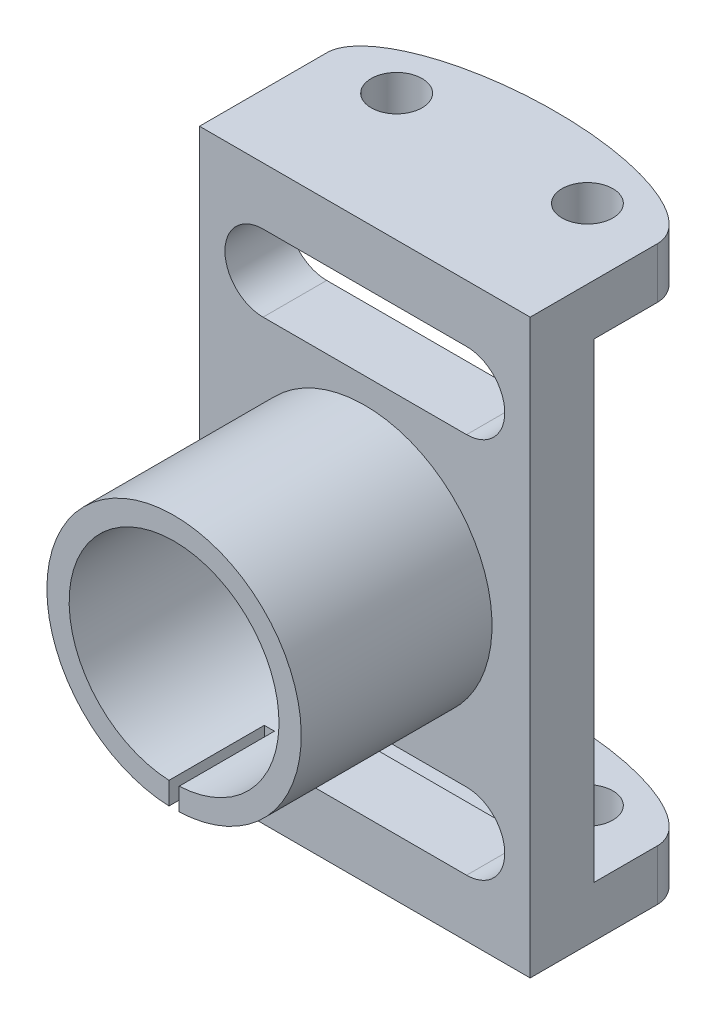
ISO-10303-21;
HEADER;
FILE_DESCRIPTION(('STEP AP214'),'2;1');
FILE_NAME('part.step','',(''),(''),'','','');
FILE_SCHEMA(('AUTOMOTIVE_DESIGN { 1 0 10303 214 1 1 1 1 }'));
ENDSEC;
DATA;
#1=APPLICATION_CONTEXT('core data for automotive mechanical design processes');
#2=APPLICATION_PROTOCOL_DEFINITION('international standard','automotive_design',2000,#1);
#3=PRODUCT_CONTEXT('',#1,'mechanical');
#4=PRODUCT('Part','Part','',(#3));
#5=PRODUCT_RELATED_PRODUCT_CATEGORY('part','',(#4));
#6=PRODUCT_DEFINITION_FORMATION('','',#4);
#7=PRODUCT_DEFINITION_CONTEXT('part definition',#1,'design');
#8=PRODUCT_DEFINITION('design','',#6,#7);
#9=PRODUCT_DEFINITION_SHAPE('','',#8);
#10=(LENGTH_UNIT() NAMED_UNIT(*) SI_UNIT(.MILLI.,.METRE.));
#11=(NAMED_UNIT(*) PLANE_ANGLE_UNIT() SI_UNIT($,.RADIAN.));
#12=(NAMED_UNIT(*) SI_UNIT($,.STERADIAN.) SOLID_ANGLE_UNIT());
#13=UNCERTAINTY_MEASURE_WITH_UNIT(LENGTH_MEASURE(1.E-05),#10,'distance_accuracy_value','');
#14=(GEOMETRIC_REPRESENTATION_CONTEXT(3) GLOBAL_UNCERTAINTY_ASSIGNED_CONTEXT((#13)) GLOBAL_UNIT_ASSIGNED_CONTEXT((#10,
#11,#12)) REPRESENTATION_CONTEXT('',''));
#15=CARTESIAN_POINT('',(0.,0.,0.));
#16=DIRECTION('',(0.,0.,1.));
#17=DIRECTION('',(1.,0.,0.));
#18=AXIS2_PLACEMENT_3D('',#15,#16,#17);
#19=CARTESIAN_POINT('',(0.,0.,0.));
#20=DIRECTION('',(0.,0.,-1.));
#21=DIRECTION('',(-1.,0.,0.));
#22=AXIS2_PLACEMENT_3D('',#19,#20,#21);
#23=PLANE('',#22);
#24=DIRECTION('',(1.,0.,0.));
#25=VECTOR('',#24,1.);
#26=CARTESIAN_POINT('',(0.,4.,0.));
#27=LINE('',#26,#25);
#28=CARTESIAN_POINT('',(0.,4.,0.));
#29=VERTEX_POINT('',#28);
#30=CARTESIAN_POINT('',(26.,4.,0.));
#31=VERTEX_POINT('',#30);
#32=EDGE_CURVE('E193',#29,#31,#27,.T.);
#33=ORIENTED_EDGE('',*,*,#32,.F.);
#34=DIRECTION('',(0.,-1.,0.));
#35=VECTOR('',#34,1.);
#36=CARTESIAN_POINT('',(0.,0.,0.));
#37=LINE('',#36,#35);
#38=CARTESIAN_POINT('',(0.,41.,0.));
#39=VERTEX_POINT('',#38);
#40=EDGE_CURVE('E190',#39,#29,#37,.T.);
#41=ORIENTED_EDGE('',*,*,#40,.F.);
#42=DIRECTION('',(1.,0.,0.));
#43=VECTOR('',#42,1.);
#44=CARTESIAN_POINT('',(0.,41.,0.));
#45=LINE('',#44,#43);
#46=CARTESIAN_POINT('',(26.,41.,0.));
#47=VERTEX_POINT('',#46);
#48=EDGE_CURVE('E363',#39,#47,#45,.T.);
#49=ORIENTED_EDGE('',*,*,#48,.T.);
#50=DIRECTION('',(0.,1.,0.));
#51=VECTOR('',#50,1.);
#52=CARTESIAN_POINT('',(26.,0.,0.));
#53=LINE('',#52,#51);
#54=EDGE_CURVE('E65',#31,#47,#53,.T.);
#55=ORIENTED_EDGE('',*,*,#54,.F.);
#56=EDGE_LOOP('',(#33,#41,#49,#55));
#57=FACE_BOUND('',#56,.T.);
#58=CARTESIAN_POINT('',(13.,22.5,0.));
#59=DIRECTION('',(0.,0.,1.));
#60=DIRECTION('',(1.,0.,0.));
#61=AXIS2_PLACEMENT_3D('',#58,#59,#60);
#62=CIRCLE('',#61,8.25);
#63=CARTESIAN_POINT('',(21.25,22.5,0.));
#64=VERTEX_POINT('',#63);
#65=EDGE_CURVE('E463',#64,#64,#62,.T.);
#66=ORIENTED_EDGE('',*,*,#65,.T.);
#67=EDGE_LOOP('',(#66));
#68=FACE_BOUND('',#67,.T.);
#69=DIRECTION('',(1.,0.,0.));
#70=VECTOR('',#69,1.);
#71=CARTESIAN_POINT('',(21.,34.5,0.));
#72=LINE('',#71,#70);
#73=CARTESIAN_POINT('',(5.,34.5,0.));
#74=VERTEX_POINT('',#73);
#75=CARTESIAN_POINT('',(21.,34.5,0.));
#76=VERTEX_POINT('',#75);
#77=EDGE_CURVE('E436',#74,#76,#72,.T.);
#78=ORIENTED_EDGE('',*,*,#77,.T.);
#79=CARTESIAN_POINT('',(21.,37.5,0.));
#80=DIRECTION('',(0.,0.,1.));
#81=DIRECTION('',(1.,0.,0.));
#82=AXIS2_PLACEMENT_3D('',#79,#80,#81);
#83=CIRCLE('',#82,3.00000000000002);
#84=CARTESIAN_POINT('',(21.,40.5,0.));
#85=VERTEX_POINT('',#84);
#86=EDGE_CURVE('E432',#76,#85,#83,.T.);
#87=ORIENTED_EDGE('',*,*,#86,.T.);
#88=DIRECTION('',(-1.,0.,0.));
#89=VECTOR('',#88,1.);
#90=CARTESIAN_POINT('',(21.,40.5,0.));
#91=LINE('',#90,#89);
#92=CARTESIAN_POINT('',(4.99999999999999,40.5,0.));
#93=VERTEX_POINT('',#92);
#94=EDGE_CURVE('E446',#85,#93,#91,.T.);
#95=ORIENTED_EDGE('',*,*,#94,.T.);
#96=CARTESIAN_POINT('',(5.,37.5,0.));
#97=DIRECTION('',(0.,0.,1.));
#98=DIRECTION('',(1.,0.,0.));
#99=AXIS2_PLACEMENT_3D('',#96,#97,#98);
#100=CIRCLE('',#99,3.00000000000002);
#101=EDGE_CURVE('E449',#93,#74,#100,.T.);
#102=ORIENTED_EDGE('',*,*,#101,.T.);
#103=EDGE_LOOP('',(#78,#87,#95,#102));
#104=FACE_BOUND('',#103,.T.);
#105=DIRECTION('',(1.,0.,0.));
#106=VECTOR('',#105,1.);
#107=CARTESIAN_POINT('',(21.,4.49999999999997,0.));
#108=LINE('',#107,#106);
#109=CARTESIAN_POINT('',(5.,4.49999999999998,0.));
#110=VERTEX_POINT('',#109);
#111=CARTESIAN_POINT('',(21.,4.49999999999997,0.));
#112=VERTEX_POINT('',#111);
#113=EDGE_CURVE('E405',#110,#112,#108,.T.);
#114=ORIENTED_EDGE('',*,*,#113,.T.);
#115=CARTESIAN_POINT('',(21.,7.5,0.));
#116=DIRECTION('',(0.,0.,1.));
#117=DIRECTION('',(-1.,0.,0.));
#118=AXIS2_PLACEMENT_3D('',#115,#116,#117);
#119=CIRCLE('',#118,3.00000000000002);
#120=CARTESIAN_POINT('',(21.,10.5,0.));
#121=VERTEX_POINT('',#120);
#122=EDGE_CURVE('E401',#112,#121,#119,.T.);
#123=ORIENTED_EDGE('',*,*,#122,.T.);
#124=DIRECTION('',(-1.,0.,0.));
#125=VECTOR('',#124,1.);
#126=CARTESIAN_POINT('',(21.,10.5,0.));
#127=LINE('',#126,#125);
#128=CARTESIAN_POINT('',(5.,10.5,0.));
#129=VERTEX_POINT('',#128);
#130=EDGE_CURVE('E415',#121,#129,#127,.T.);
#131=ORIENTED_EDGE('',*,*,#130,.T.);
#132=CARTESIAN_POINT('',(5.,7.5,0.));
#133=DIRECTION('',(0.,0.,1.));
#134=DIRECTION('',(-1.,0.,0.));
#135=AXIS2_PLACEMENT_3D('',#132,#133,#134);
#136=CIRCLE('',#135,3.00000000000002);
#137=EDGE_CURVE('E418',#129,#110,#136,.T.);
#138=ORIENTED_EDGE('',*,*,#137,.T.);
#139=EDGE_LOOP('',(#114,#123,#131,#138));
#140=FACE_BOUND('',#139,.T.);
#141=ADVANCED_FACE('F45',(#57,#68,#104,#140),#23,.T.);
#142=CARTESIAN_POINT('',(13.,22.5,12.5));
#143=DIRECTION('',(0.,0.,1.));
#144=DIRECTION('',(1.,0.,0.));
#145=AXIS2_PLACEMENT_3D('',#142,#143,#144);
#146=PLANE('',#145);
#147=CARTESIAN_POINT('',(13.,22.5,12.5));
#148=DIRECTION('',(0.,0.,1.));
#149=DIRECTION('',(1.,0.,0.));
#150=AXIS2_PLACEMENT_3D('',#147,#148,#149);
#151=CIRCLE('',#150,8.25);
#152=CARTESIAN_POINT('',(12.6,14.2597026752671,12.5));
#153=VERTEX_POINT('',#152);
#154=CARTESIAN_POINT('',(13.4,14.2597026752671,12.5));
#155=VERTEX_POINT('',#154);
#156=EDGE_CURVE('E396',#153,#155,#151,.T.);
#157=ORIENTED_EDGE('',*,*,#156,.F.);
#158=DIRECTION('',(0.,-1.,0.));
#159=VECTOR('',#158,1.);
#160=CARTESIAN_POINT('',(12.6,0.,12.5));
#161=LINE('',#160,#159);
#162=CARTESIAN_POINT('',(12.6,12.5080032025626,12.5));
#163=VERTEX_POINT('',#162);
#164=EDGE_CURVE('E369',#153,#163,#161,.T.);
#165=ORIENTED_EDGE('',*,*,#164,.T.);
#166=CARTESIAN_POINT('',(13.,22.5,12.5));
#167=DIRECTION('',(0.,0.,1.));
#168=DIRECTION('',(1.,0.,0.));
#169=AXIS2_PLACEMENT_3D('',#166,#167,#168);
#170=CIRCLE('',#169,10.);
#171=CARTESIAN_POINT('',(13.4,12.5080032025626,12.5));
#172=VERTEX_POINT('',#171);
#173=EDGE_CURVE('E399',#163,#172,#170,.T.);
#174=ORIENTED_EDGE('',*,*,#173,.T.);
#175=DIRECTION('',(0.,-1.,0.));
#176=VECTOR('',#175,1.);
#177=CARTESIAN_POINT('',(13.4,0.,12.5));
#178=LINE('',#177,#176);
#179=EDGE_CURVE('E375',#155,#172,#178,.T.);
#180=ORIENTED_EDGE('',*,*,#179,.F.);
#181=EDGE_LOOP('',(#157,#165,#174,#180));
#182=FACE_BOUND('',#181,.T.);
#183=ADVANCED_FACE('F250',(#182),#146,.T.);
#184=CARTESIAN_POINT('',(0.,0.,5.));
#185=DIRECTION('',(0.,0.,-1.));
#186=DIRECTION('',(-1.,0.,0.));
#187=AXIS2_PLACEMENT_3D('',#184,#185,#186);
#188=PLANE('',#187);
#189=CARTESIAN_POINT('',(21.,7.5,5.));
#190=DIRECTION('',(0.,0.,1.));
#191=DIRECTION('',(-1.,0.,0.));
#192=AXIS2_PLACEMENT_3D('',#189,#190,#191);
#193=CIRCLE('',#192,3.00000000000002);
#194=CARTESIAN_POINT('',(21.,4.49999999999997,5.));
#195=VERTEX_POINT('',#194);
#196=CARTESIAN_POINT('',(21.,10.5,5.));
#197=VERTEX_POINT('',#196);
#198=EDGE_CURVE('E402',#195,#197,#193,.T.);
#199=ORIENTED_EDGE('',*,*,#198,.F.);
#200=DIRECTION('',(1.,0.,0.));
#201=VECTOR('',#200,1.);
#202=CARTESIAN_POINT('',(21.,4.49999999999997,5.));
#203=LINE('',#202,#201);
#204=CARTESIAN_POINT('',(5.,4.49999999999997,5.));
#205=VERTEX_POINT('',#204);
#206=EDGE_CURVE('E410',#205,#195,#203,.T.);
#207=ORIENTED_EDGE('',*,*,#206,.F.);
#208=CARTESIAN_POINT('',(5.,7.5,5.));
#209=DIRECTION('',(0.,0.,1.));
#210=DIRECTION('',(-1.,0.,0.));
#211=AXIS2_PLACEMENT_3D('',#208,#209,#210);
#212=CIRCLE('',#211,3.00000000000002);
#213=CARTESIAN_POINT('',(5.,10.5,5.));
#214=VERTEX_POINT('',#213);
#215=EDGE_CURVE('E407',#214,#205,#212,.T.);
#216=ORIENTED_EDGE('',*,*,#215,.F.);
#217=DIRECTION('',(-1.,0.,0.));
#218=VECTOR('',#217,1.);
#219=CARTESIAN_POINT('',(21.,10.5,5.));
#220=LINE('',#219,#218);
#221=EDGE_CURVE('E404',#197,#214,#220,.T.);
#222=ORIENTED_EDGE('',*,*,#221,.F.);
#223=EDGE_LOOP('',(#199,#207,#216,#222));
#224=FACE_BOUND('',#223,.T.);
#225=DIRECTION('',(0.,-1.,0.));
#226=VECTOR('',#225,1.);
#227=CARTESIAN_POINT('',(0.,0.,5.));
#228=LINE('',#227,#226);
#229=CARTESIAN_POINT('',(0.,45.,5.));
#230=VERTEX_POINT('',#229);
#231=CARTESIAN_POINT('',(0.,0.,5.));
#232=VERTEX_POINT('',#231);
#233=EDGE_CURVE('E466',#230,#232,#228,.T.);
#234=ORIENTED_EDGE('',*,*,#233,.T.);
#235=DIRECTION('',(1.,0.,0.));
#236=VECTOR('',#235,1.);
#237=CARTESIAN_POINT('',(0.,0.,5.));
#238=LINE('',#237,#236);
#239=CARTESIAN_POINT('',(26.,0.,5.));
#240=VERTEX_POINT('',#239);
#241=EDGE_CURVE('E469',#232,#240,#238,.T.);
#242=ORIENTED_EDGE('',*,*,#241,.T.);
#243=DIRECTION('',(0.,1.,0.));
#244=VECTOR('',#243,1.);
#245=CARTESIAN_POINT('',(26.,0.,5.));
#246=LINE('',#245,#244);
#247=CARTESIAN_POINT('',(26.,45.,5.));
#248=VERTEX_POINT('',#247);
#249=EDGE_CURVE('E471',#240,#248,#246,.T.);
#250=ORIENTED_EDGE('',*,*,#249,.T.);
#251=DIRECTION('',(-1.,0.,0.));
#252=VECTOR('',#251,1.);
#253=CARTESIAN_POINT('',(0.,45.,5.));
#254=LINE('',#253,#252);
#255=EDGE_CURVE('E473',#248,#230,#254,.T.);
#256=ORIENTED_EDGE('',*,*,#255,.T.);
#257=EDGE_LOOP('',(#234,#242,#250,#256));
#258=FACE_BOUND('',#257,.T.);
#259=CARTESIAN_POINT('',(21.,37.5,5.));
#260=DIRECTION('',(0.,0.,1.));
#261=DIRECTION('',(1.,0.,0.));
#262=AXIS2_PLACEMENT_3D('',#259,#260,#261);
#263=CIRCLE('',#262,3.00000000000002);
#264=CARTESIAN_POINT('',(21.,34.5,5.));
#265=VERTEX_POINT('',#264);
#266=CARTESIAN_POINT('',(21.,40.5,5.));
#267=VERTEX_POINT('',#266);
#268=EDGE_CURVE('E433',#265,#267,#263,.T.);
#269=ORIENTED_EDGE('',*,*,#268,.F.);
#270=DIRECTION('',(1.,0.,0.));
#271=VECTOR('',#270,1.);
#272=CARTESIAN_POINT('',(21.,34.5,5.));
#273=LINE('',#272,#271);
#274=CARTESIAN_POINT('',(5.,34.5,5.));
#275=VERTEX_POINT('',#274);
#276=EDGE_CURVE('E441',#275,#265,#273,.T.);
#277=ORIENTED_EDGE('',*,*,#276,.F.);
#278=CARTESIAN_POINT('',(5.,37.5,5.));
#279=DIRECTION('',(0.,0.,1.));
#280=DIRECTION('',(1.,0.,0.));
#281=AXIS2_PLACEMENT_3D('',#278,#279,#280);
#282=CIRCLE('',#281,3.00000000000002);
#283=CARTESIAN_POINT('',(4.99999999999999,40.5,5.));
#284=VERTEX_POINT('',#283);
#285=EDGE_CURVE('E438',#284,#275,#282,.T.);
#286=ORIENTED_EDGE('',*,*,#285,.F.);
#287=DIRECTION('',(-1.,0.,0.));
#288=VECTOR('',#287,1.);
#289=CARTESIAN_POINT('',(21.,40.5,5.));
#290=LINE('',#289,#288);
#291=EDGE_CURVE('E435',#267,#284,#290,.T.);
#292=ORIENTED_EDGE('',*,*,#291,.F.);
#293=EDGE_LOOP('',(#269,#277,#286,#292));
#294=FACE_BOUND('',#293,.T.);
#295=CARTESIAN_POINT('',(13.,22.5,5.));
#296=DIRECTION('',(0.,0.,-1.));
#297=DIRECTION('',(-1.,0.,0.));
#298=AXIS2_PLACEMENT_3D('',#295,#296,#297);
#299=CIRCLE('',#298,10.);
#300=CARTESIAN_POINT('',(3.,22.5,5.));
#301=VERTEX_POINT('',#300);
#302=EDGE_CURVE('E11',#301,#301,#299,.F.);
#303=ORIENTED_EDGE('',*,*,#302,.F.);
#304=EDGE_LOOP('',(#303));
#305=FACE_BOUND('',#304,.T.);
#306=ADVANCED_FACE('F253',(#224,#258,#294,#305),#188,.F.);
#307=CARTESIAN_POINT('',(0.,0.,5.));
#308=DIRECTION('',(1.,0.,0.));
#309=DIRECTION('',(0.,0.,-1.));
#310=AXIS2_PLACEMENT_3D('',#307,#308,#309);
#311=PLANE('',#310);
#312=DIRECTION('',(0.,0.,-1.));
#313=VECTOR('',#312,1.);
#314=CARTESIAN_POINT('',(0.,45.,5.));
#315=LINE('',#314,#313);
#316=CARTESIAN_POINT('',(0.,45.,-5.));
#317=VERTEX_POINT('',#316);
#318=EDGE_CURVE('E475',#230,#317,#315,.T.);
#319=ORIENTED_EDGE('',*,*,#318,.T.);
#320=DIRECTION('',(0.,1.,0.));
#321=VECTOR('',#320,1.);
#322=CARTESIAN_POINT('',(0.,41.,-5.));
#323=LINE('',#322,#321);
#324=CARTESIAN_POINT('',(0.,41.,-5.));
#325=VERTEX_POINT('',#324);
#326=EDGE_CURVE('E362',#325,#317,#323,.T.);
#327=ORIENTED_EDGE('',*,*,#326,.F.);
#328=DIRECTION('',(0.,0.,1.));
#329=VECTOR('',#328,1.);
#330=CARTESIAN_POINT('',(0.,41.,-5.));
#331=LINE('',#330,#329);
#332=EDGE_CURVE('E227',#325,#39,#331,.T.);
#333=ORIENTED_EDGE('',*,*,#332,.T.);
#334=ORIENTED_EDGE('',*,*,#40,.T.);
#335=DIRECTION('',(0.,0.,1.));
#336=VECTOR('',#335,1.);
#337=CARTESIAN_POINT('',(0.,4.,-5.));
#338=LINE('',#337,#336);
#339=CARTESIAN_POINT('',(0.,4.,-5.));
#340=VERTEX_POINT('',#339);
#341=EDGE_CURVE('E182',#340,#29,#338,.T.);
#342=ORIENTED_EDGE('',*,*,#341,.F.);
#343=DIRECTION('',(0.,-1.,0.));
#344=VECTOR('',#343,1.);
#345=CARTESIAN_POINT('',(0.,4.,-5.));
#346=LINE('',#345,#344);
#347=CARTESIAN_POINT('',(0.,0.,-5.));
#348=VERTEX_POINT('',#347);
#349=EDGE_CURVE('E186',#340,#348,#346,.T.);
#350=ORIENTED_EDGE('',*,*,#349,.T.);
#351=DIRECTION('',(0.,0.,-1.));
#352=VECTOR('',#351,1.);
#353=CARTESIAN_POINT('',(0.,0.,5.));
#354=LINE('',#353,#352);
#355=EDGE_CURVE('E53',#232,#348,#354,.T.);
#356=ORIENTED_EDGE('',*,*,#355,.F.);
#357=ORIENTED_EDGE('',*,*,#233,.F.);
#358=EDGE_LOOP('',(#319,#327,#333,#334,#342,#350,#356,#357));
#359=FACE_BOUND('',#358,.T.);
#360=ADVANCED_FACE('F47',(#359),#311,.F.);
#361=CARTESIAN_POINT('',(0.,0.,5.));
#362=DIRECTION('',(0.,1.,0.));
#363=DIRECTION('',(0.,0.,1.));
#364=AXIS2_PLACEMENT_3D('',#361,#362,#363);
#365=PLANE('',#364);
#366=ORIENTED_EDGE('',*,*,#355,.T.);
#367=CARTESIAN_POINT('',(13.,0.,-5.));
#368=DIRECTION('',(0.,1.,0.));
#369=DIRECTION('',(1.,0.,0.));
#370=AXIS2_PLACEMENT_3D('',#367,#368,#369);
#371=ELLIPSE('',#370,13.,5.);
#372=CARTESIAN_POINT('',(26.,0.,-5.));
#373=VERTEX_POINT('',#372);
#374=EDGE_CURVE('E201',#373,#348,#371,.T.);
#375=ORIENTED_EDGE('',*,*,#374,.F.);
#376=DIRECTION('',(0.,0.,-1.));
#377=VECTOR('',#376,1.);
#378=CARTESIAN_POINT('',(26.,0.,5.));
#379=LINE('',#378,#377);
#380=EDGE_CURVE('E481',#240,#373,#379,.T.);
#381=ORIENTED_EDGE('',*,*,#380,.F.);
#382=ORIENTED_EDGE('',*,*,#241,.F.);
#383=EDGE_LOOP('',(#366,#375,#381,#382));
#384=FACE_BOUND('',#383,.T.);
#385=CARTESIAN_POINT('',(5.5,0.,-5.));
#386=DIRECTION('',(0.,1.,0.));
#387=DIRECTION('',(0.,0.,1.));
#388=AXIS2_PLACEMENT_3D('',#385,#386,#387);
#389=CIRCLE('',#388,2.);
#390=CARTESIAN_POINT('',(5.5,0.,-3.));
#391=VERTEX_POINT('',#390);
#392=EDGE_CURVE('E316',#391,#391,#389,.T.);
#393=ORIENTED_EDGE('',*,*,#392,.T.);
#394=EDGE_LOOP('',(#393));
#395=FACE_BOUND('',#394,.T.);
#396=CARTESIAN_POINT('',(20.5,0.,-5.));
#397=DIRECTION('',(0.,1.,0.));
#398=DIRECTION('',(0.,0.,1.));
#399=AXIS2_PLACEMENT_3D('',#396,#397,#398);
#400=CIRCLE('',#399,2.);
#401=CARTESIAN_POINT('',(20.5,0.,-3.));
#402=VERTEX_POINT('',#401);
#403=EDGE_CURVE('E319',#402,#402,#400,.T.);
#404=ORIENTED_EDGE('',*,*,#403,.T.);
#405=EDGE_LOOP('',(#404));
#406=FACE_BOUND('',#405,.T.);
#407=ADVANCED_FACE('F306',(#384,#395,#406),#365,.F.);
#408=CARTESIAN_POINT('',(26.,0.,5.));
#409=DIRECTION('',(-1.,0.,0.));
#410=DIRECTION('',(0.,0.,1.));
#411=AXIS2_PLACEMENT_3D('',#408,#409,#410);
#412=PLANE('',#411);
#413=ORIENTED_EDGE('',*,*,#380,.T.);
#414=DIRECTION('',(0.,-1.,0.));
#415=VECTOR('',#414,1.);
#416=CARTESIAN_POINT('',(26.,4.,-5.));
#417=LINE('',#416,#415);
#418=CARTESIAN_POINT('',(26.,4.,-5.));
#419=VERTEX_POINT('',#418);
#420=EDGE_CURVE('E206',#419,#373,#417,.T.);
#421=ORIENTED_EDGE('',*,*,#420,.F.);
#422=DIRECTION('',(0.,0.,-1.));
#423=VECTOR('',#422,1.);
#424=CARTESIAN_POINT('',(26.,4.,0.));
#425=LINE('',#424,#423);
#426=EDGE_CURVE('E60',#31,#419,#425,.T.);
#427=ORIENTED_EDGE('',*,*,#426,.F.);
#428=ORIENTED_EDGE('',*,*,#54,.T.);
#429=DIRECTION('',(0.,0.,-1.));
#430=VECTOR('',#429,1.);
#431=CARTESIAN_POINT('',(26.,41.,0.));
#432=LINE('',#431,#430);
#433=CARTESIAN_POINT('',(26.,41.,-5.));
#434=VERTEX_POINT('',#433);
#435=EDGE_CURVE('E355',#47,#434,#432,.T.);
#436=ORIENTED_EDGE('',*,*,#435,.T.);
#437=DIRECTION('',(0.,1.,0.));
#438=VECTOR('',#437,1.);
#439=CARTESIAN_POINT('',(26.,41.,-5.));
#440=LINE('',#439,#438);
#441=CARTESIAN_POINT('',(26.,45.,-5.));
#442=VERTEX_POINT('',#441);
#443=EDGE_CURVE('E360',#434,#442,#440,.T.);
#444=ORIENTED_EDGE('',*,*,#443,.T.);
#445=DIRECTION('',(0.,0.,-1.));
#446=VECTOR('',#445,1.);
#447=CARTESIAN_POINT('',(26.,45.,5.));
#448=LINE('',#447,#446);
#449=EDGE_CURVE('E479',#248,#442,#448,.T.);
#450=ORIENTED_EDGE('',*,*,#449,.F.);
#451=ORIENTED_EDGE('',*,*,#249,.F.);
#452=EDGE_LOOP('',(#413,#421,#427,#428,#436,#444,#450,#451));
#453=FACE_BOUND('',#452,.T.);
#454=ADVANCED_FACE('F303',(#453),#412,.F.);
#455=CARTESIAN_POINT('',(0.,45.,5.));
#456=DIRECTION('',(0.,-1.,0.));
#457=DIRECTION('',(0.,0.,-1.));
#458=AXIS2_PLACEMENT_3D('',#455,#456,#457);
#459=PLANE('',#458);
#460=ORIENTED_EDGE('',*,*,#449,.T.);
#461=CARTESIAN_POINT('',(13.,45.,-5.));
#462=DIRECTION('',(0.,1.,0.));
#463=DIRECTION('',(1.,0.,0.));
#464=AXIS2_PLACEMENT_3D('',#461,#462,#463);
#465=ELLIPSE('',#464,13.,5.);
#466=EDGE_CURVE('E220',#442,#317,#465,.T.);
#467=ORIENTED_EDGE('',*,*,#466,.T.);
#468=ORIENTED_EDGE('',*,*,#318,.F.);
#469=ORIENTED_EDGE('',*,*,#255,.F.);
#470=EDGE_LOOP('',(#460,#467,#468,#469));
#471=FACE_BOUND('',#470,.T.);
#472=CARTESIAN_POINT('',(20.5,45.,-5.));
#473=DIRECTION('',(0.,1.,0.));
#474=DIRECTION('',(0.,0.,1.));
#475=AXIS2_PLACEMENT_3D('',#472,#473,#474);
#476=CIRCLE('',#475,2.);
#477=CARTESIAN_POINT('',(20.5,45.,-3.));
#478=VERTEX_POINT('',#477);
#479=EDGE_CURVE('E205',#478,#478,#476,.T.);
#480=ORIENTED_EDGE('',*,*,#479,.F.);
#481=EDGE_LOOP('',(#480));
#482=FACE_BOUND('',#481,.T.);
#483=CARTESIAN_POINT('',(5.5,45.,-5.));
#484=DIRECTION('',(0.,1.,0.));
#485=DIRECTION('',(0.,0.,1.));
#486=AXIS2_PLACEMENT_3D('',#483,#484,#485);
#487=CIRCLE('',#486,2.);
#488=CARTESIAN_POINT('',(5.5,45.,-3.));
#489=VERTEX_POINT('',#488);
#490=EDGE_CURVE('E215',#489,#489,#487,.T.);
#491=ORIENTED_EDGE('',*,*,#490,.F.);
#492=EDGE_LOOP('',(#491));
#493=FACE_BOUND('',#492,.T.);
#494=ADVANCED_FACE('F293',(#471,#482,#493),#459,.F.);
#495=CARTESIAN_POINT('',(13.,22.5,5.));
#496=DIRECTION('',(0.,0.,-1.));
#497=DIRECTION('',(-1.,0.,0.));
#498=AXIS2_PLACEMENT_3D('',#495,#496,#497);
#499=CYLINDRICAL_SURFACE('',#498,8.25);
#500=ORIENTED_EDGE('',*,*,#65,.F.);
#501=EDGE_LOOP('',(#500));
#502=FACE_BOUND('',#501,.T.);
#503=ORIENTED_EDGE('',*,*,#156,.T.);
#504=DIRECTION('',(0.,0.,-1.));
#505=VECTOR('',#504,1.);
#506=CARTESIAN_POINT('',(13.4,14.2597026752671,20.));
#507=LINE('',#506,#505);
#508=CARTESIAN_POINT('',(13.4,14.2597026752671,20.));
#509=VERTEX_POINT('',#508);
#510=EDGE_CURVE('E390',#509,#155,#507,.T.);
#511=ORIENTED_EDGE('',*,*,#510,.F.);
#512=CARTESIAN_POINT('',(13.,22.5,20.));
#513=DIRECTION('',(0.,0.,1.));
#514=DIRECTION('',(1.,0.,0.));
#515=AXIS2_PLACEMENT_3D('',#512,#513,#514);
#516=CIRCLE('',#515,8.25);
#517=CARTESIAN_POINT('',(12.6,14.2597026752671,20.));
#518=VERTEX_POINT('',#517);
#519=EDGE_CURVE('E374',#518,#509,#516,.F.);
#520=ORIENTED_EDGE('',*,*,#519,.F.);
#521=DIRECTION('',(0.,0.,-1.));
#522=VECTOR('',#521,1.);
#523=CARTESIAN_POINT('',(12.6,14.2597026752671,20.));
#524=LINE('',#523,#522);
#525=EDGE_CURVE('E393',#518,#153,#524,.T.);
#526=ORIENTED_EDGE('',*,*,#525,.T.);
#527=EDGE_LOOP('',(#503,#511,#520,#526));
#528=FACE_BOUND('',#527,.T.);
#529=ADVANCED_FACE('F289',(#502,#528),#499,.F.);
#530=CARTESIAN_POINT('',(21.,37.5,5.));
#531=DIRECTION('',(0.,0.,-1.));
#532=DIRECTION('',(-1.,0.,0.));
#533=AXIS2_PLACEMENT_3D('',#530,#531,#532);
#534=CYLINDRICAL_SURFACE('',#533,3.00000000000002);
#535=ORIENTED_EDGE('',*,*,#86,.F.);
#536=DIRECTION('',(0.,0.,-1.));
#537=VECTOR('',#536,1.);
#538=CARTESIAN_POINT('',(21.,34.5,5.));
#539=LINE('',#538,#537);
#540=EDGE_CURVE('E443',#265,#76,#539,.T.);
#541=ORIENTED_EDGE('',*,*,#540,.F.);
#542=ORIENTED_EDGE('',*,*,#268,.T.);
#543=DIRECTION('',(0.,0.,-1.));
#544=VECTOR('',#543,1.);
#545=CARTESIAN_POINT('',(21.,40.5,5.));
#546=LINE('',#545,#544);
#547=EDGE_CURVE('E460',#267,#85,#546,.T.);
#548=ORIENTED_EDGE('',*,*,#547,.T.);
#549=EDGE_LOOP('',(#535,#541,#542,#548));
#550=FACE_BOUND('',#549,.T.);
#551=ADVANCED_FACE('F285',(#550),#534,.F.);
#552=CARTESIAN_POINT('',(21.,40.5,5.));
#553=DIRECTION('',(0.,-1.,0.));
#554=DIRECTION('',(0.,0.,-1.));
#555=AXIS2_PLACEMENT_3D('',#552,#553,#554);
#556=PLANE('',#555);
#557=ORIENTED_EDGE('',*,*,#94,.F.);
#558=ORIENTED_EDGE('',*,*,#547,.F.);
#559=ORIENTED_EDGE('',*,*,#291,.T.);
#560=DIRECTION('',(0.,0.,-1.));
#561=VECTOR('',#560,1.);
#562=CARTESIAN_POINT('',(4.99999999999999,40.5,5.));
#563=LINE('',#562,#561);
#564=EDGE_CURVE('E458',#284,#93,#563,.T.);
#565=ORIENTED_EDGE('',*,*,#564,.T.);
#566=EDGE_LOOP('',(#557,#558,#559,#565));
#567=FACE_BOUND('',#566,.T.);
#568=ADVANCED_FACE('F281',(#567),#556,.T.);
#569=CARTESIAN_POINT('',(5.,37.5,5.));
#570=DIRECTION('',(0.,0.,-1.));
#571=DIRECTION('',(-1.,0.,0.));
#572=AXIS2_PLACEMENT_3D('',#569,#570,#571);
#573=CYLINDRICAL_SURFACE('',#572,3.00000000000002);
#574=ORIENTED_EDGE('',*,*,#101,.F.);
#575=ORIENTED_EDGE('',*,*,#564,.F.);
#576=ORIENTED_EDGE('',*,*,#285,.T.);
#577=DIRECTION('',(0.,0.,-1.));
#578=VECTOR('',#577,1.);
#579=CARTESIAN_POINT('',(5.,34.5,5.));
#580=LINE('',#579,#578);
#581=EDGE_CURVE('E456',#275,#74,#580,.T.);
#582=ORIENTED_EDGE('',*,*,#581,.T.);
#583=EDGE_LOOP('',(#574,#575,#576,#582));
#584=FACE_BOUND('',#583,.T.);
#585=ADVANCED_FACE('F277',(#584),#573,.F.);
#586=CARTESIAN_POINT('',(21.,34.5,5.));
#587=DIRECTION('',(0.,1.,0.));
#588=DIRECTION('',(0.,0.,1.));
#589=AXIS2_PLACEMENT_3D('',#586,#587,#588);
#590=PLANE('',#589);
#591=ORIENTED_EDGE('',*,*,#77,.F.);
#592=ORIENTED_EDGE('',*,*,#581,.F.);
#593=ORIENTED_EDGE('',*,*,#276,.T.);
#594=ORIENTED_EDGE('',*,*,#540,.T.);
#595=EDGE_LOOP('',(#591,#592,#593,#594));
#596=FACE_BOUND('',#595,.T.);
#597=ADVANCED_FACE('F273',(#596),#590,.T.);
#598=CARTESIAN_POINT('',(21.,7.5,5.));
#599=DIRECTION('',(0.,0.,-1.));
#600=DIRECTION('',(-1.,0.,0.));
#601=AXIS2_PLACEMENT_3D('',#598,#599,#600);
#602=CYLINDRICAL_SURFACE('',#601,3.00000000000002);
#603=ORIENTED_EDGE('',*,*,#122,.F.);
#604=DIRECTION('',(0.,0.,-1.));
#605=VECTOR('',#604,1.);
#606=CARTESIAN_POINT('',(21.,4.49999999999997,5.));
#607=LINE('',#606,#605);
#608=EDGE_CURVE('E412',#195,#112,#607,.T.);
#609=ORIENTED_EDGE('',*,*,#608,.F.);
#610=ORIENTED_EDGE('',*,*,#198,.T.);
#611=DIRECTION('',(0.,0.,-1.));
#612=VECTOR('',#611,1.);
#613=CARTESIAN_POINT('',(21.,10.5,5.));
#614=LINE('',#613,#612);
#615=EDGE_CURVE('E429',#197,#121,#614,.T.);
#616=ORIENTED_EDGE('',*,*,#615,.T.);
#617=EDGE_LOOP('',(#603,#609,#610,#616));
#618=FACE_BOUND('',#617,.T.);
#619=ADVANCED_FACE('F269',(#618),#602,.F.);
#620=CARTESIAN_POINT('',(21.,10.5,5.));
#621=DIRECTION('',(0.,-1.,0.));
#622=DIRECTION('',(0.,0.,-1.));
#623=AXIS2_PLACEMENT_3D('',#620,#621,#622);
#624=PLANE('',#623);
#625=ORIENTED_EDGE('',*,*,#130,.F.);
#626=ORIENTED_EDGE('',*,*,#615,.F.);
#627=ORIENTED_EDGE('',*,*,#221,.T.);
#628=DIRECTION('',(0.,0.,-1.));
#629=VECTOR('',#628,1.);
#630=CARTESIAN_POINT('',(5.,10.5,5.));
#631=LINE('',#630,#629);
#632=EDGE_CURVE('E427',#214,#129,#631,.T.);
#633=ORIENTED_EDGE('',*,*,#632,.T.);
#634=EDGE_LOOP('',(#625,#626,#627,#633));
#635=FACE_BOUND('',#634,.T.);
#636=ADVANCED_FACE('F265',(#635),#624,.T.);
#637=CARTESIAN_POINT('',(5.,7.5,5.));
#638=DIRECTION('',(0.,0.,-1.));
#639=DIRECTION('',(-1.,0.,0.));
#640=AXIS2_PLACEMENT_3D('',#637,#638,#639);
#641=CYLINDRICAL_SURFACE('',#640,3.00000000000002);
#642=ORIENTED_EDGE('',*,*,#137,.F.);
#643=ORIENTED_EDGE('',*,*,#632,.F.);
#644=ORIENTED_EDGE('',*,*,#215,.T.);
#645=DIRECTION('',(0.,0.,-1.));
#646=VECTOR('',#645,1.);
#647=CARTESIAN_POINT('',(5.,4.49999999999998,5.));
#648=LINE('',#647,#646);
#649=EDGE_CURVE('E425',#205,#110,#648,.T.);
#650=ORIENTED_EDGE('',*,*,#649,.T.);
#651=EDGE_LOOP('',(#642,#643,#644,#650));
#652=FACE_BOUND('',#651,.T.);
#653=ADVANCED_FACE('F261',(#652),#641,.F.);
#654=CARTESIAN_POINT('',(21.,4.49999999999997,5.));
#655=DIRECTION('',(0.,1.,0.));
#656=DIRECTION('',(0.,0.,1.));
#657=AXIS2_PLACEMENT_3D('',#654,#655,#656);
#658=PLANE('',#657);
#659=ORIENTED_EDGE('',*,*,#113,.F.);
#660=ORIENTED_EDGE('',*,*,#649,.F.);
#661=ORIENTED_EDGE('',*,*,#206,.T.);
#662=ORIENTED_EDGE('',*,*,#608,.T.);
#663=EDGE_LOOP('',(#659,#660,#661,#662));
#664=FACE_BOUND('',#663,.T.);
#665=ADVANCED_FACE('F257',(#664),#658,.T.);
#666=CARTESIAN_POINT('',(13.,22.5,12.5));
#667=DIRECTION('',(0.,0.,-1.));
#668=DIRECTION('',(-1.,0.,0.));
#669=AXIS2_PLACEMENT_3D('',#666,#667,#668);
#670=CYLINDRICAL_SURFACE('',#669,10.);
#671=ORIENTED_EDGE('',*,*,#173,.F.);
#672=DIRECTION('',(0.,0.,-1.));
#673=VECTOR('',#672,1.);
#674=CARTESIAN_POINT('',(12.6,12.5080032025626,20.));
#675=LINE('',#674,#673);
#676=CARTESIAN_POINT('',(12.6,12.5080032025626,20.));
#677=VERTEX_POINT('',#676);
#678=EDGE_CURVE('E381',#677,#163,#675,.T.);
#679=ORIENTED_EDGE('',*,*,#678,.F.);
#680=CARTESIAN_POINT('',(13.,22.5,20.));
#681=DIRECTION('',(0.,0.,1.));
#682=DIRECTION('',(1.,0.,0.));
#683=AXIS2_PLACEMENT_3D('',#680,#681,#682);
#684=CIRCLE('',#683,10.);
#685=CARTESIAN_POINT('',(13.4,12.5080032025626,20.));
#686=VERTEX_POINT('',#685);
#687=EDGE_CURVE('E379',#686,#677,#684,.T.);
#688=ORIENTED_EDGE('',*,*,#687,.F.);
#689=DIRECTION('',(0.,0.,-1.));
#690=VECTOR('',#689,1.);
#691=CARTESIAN_POINT('',(13.4,12.5080032025626,20.));
#692=LINE('',#691,#690);
#693=EDGE_CURVE('E387',#686,#172,#692,.T.);
#694=ORIENTED_EDGE('',*,*,#693,.T.);
#695=EDGE_LOOP('',(#671,#679,#688,#694));
#696=FACE_BOUND('',#695,.T.);
#697=ORIENTED_EDGE('',*,*,#302,.T.);
#698=EDGE_LOOP('',(#697));
#699=FACE_BOUND('',#698,.T.);
#700=ADVANCED_FACE('F248',(#696,#699),#670,.T.);
#701=CARTESIAN_POINT('',(12.6,0.,20.));
#702=DIRECTION('',(1.,0.,0.));
#703=DIRECTION('',(0.,0.,-1.));
#704=AXIS2_PLACEMENT_3D('',#701,#702,#703);
#705=PLANE('',#704);
#706=ORIENTED_EDGE('',*,*,#164,.F.);
#707=ORIENTED_EDGE('',*,*,#525,.F.);
#708=DIRECTION('',(0.,-1.,0.));
#709=VECTOR('',#708,1.);
#710=CARTESIAN_POINT('',(12.6,0.,20.));
#711=LINE('',#710,#709);
#712=EDGE_CURVE('E371',#518,#677,#711,.T.);
#713=ORIENTED_EDGE('',*,*,#712,.T.);
#714=ORIENTED_EDGE('',*,*,#678,.T.);
#715=EDGE_LOOP('',(#706,#707,#713,#714));
#716=FACE_BOUND('',#715,.T.);
#717=ADVANCED_FACE('F244',(#716),#705,.T.);
#718=CARTESIAN_POINT('',(13.4,0.,20.));
#719=DIRECTION('',(1.,0.,0.));
#720=DIRECTION('',(0.,0.,-1.));
#721=AXIS2_PLACEMENT_3D('',#718,#719,#720);
#722=PLANE('',#721);
#723=ORIENTED_EDGE('',*,*,#179,.T.);
#724=ORIENTED_EDGE('',*,*,#693,.F.);
#725=DIRECTION('',(0.,-1.,0.));
#726=VECTOR('',#725,1.);
#727=CARTESIAN_POINT('',(13.4,0.,20.));
#728=LINE('',#727,#726);
#729=EDGE_CURVE('E377',#509,#686,#728,.T.);
#730=ORIENTED_EDGE('',*,*,#729,.F.);
#731=ORIENTED_EDGE('',*,*,#510,.T.);
#732=EDGE_LOOP('',(#723,#724,#730,#731));
#733=FACE_BOUND('',#732,.T.);
#734=ADVANCED_FACE('F240',(#733),#722,.F.);
#735=CARTESIAN_POINT('',(0.,0.,20.));
#736=DIRECTION('',(0.,0.,1.));
#737=DIRECTION('',(1.,0.,0.));
#738=AXIS2_PLACEMENT_3D('',#735,#736,#737);
#739=PLANE('',#738);
#740=ORIENTED_EDGE('',*,*,#712,.F.);
#741=ORIENTED_EDGE('',*,*,#519,.T.);
#742=ORIENTED_EDGE('',*,*,#729,.T.);
#743=ORIENTED_EDGE('',*,*,#687,.T.);
#744=EDGE_LOOP('',(#740,#741,#742,#743));
#745=FACE_BOUND('',#744,.T.);
#746=ADVANCED_FACE('F235',(#745),#739,.T.);
#747=CARTESIAN_POINT('',(13.,41.,-5.));
#748=DIRECTION('',(0.,1.,0.));
#749=DIRECTION('',(1.,0.,0.));
#750=AXIS2_PLACEMENT_3D('',#747,#748,#749);
#751=ELLIPSE('',#750,13.,5.);
#752=DIRECTION('',(0.,1.,0.));
#753=VECTOR('',#752,1.);
#754=SURFACE_OF_LINEAR_EXTRUSION('',#751,#753);
#755=ORIENTED_EDGE('',*,*,#466,.F.);
#756=ORIENTED_EDGE('',*,*,#443,.F.);
#757=EDGE_CURVE('E223',#434,#325,#751,.T.);
#758=ORIENTED_EDGE('',*,*,#757,.T.);
#759=ORIENTED_EDGE('',*,*,#326,.T.);
#760=EDGE_LOOP('',(#755,#756,#758,#759));
#761=FACE_BOUND('',#760,.T.);
#762=ADVANCED_FACE('F230',(#761),#754,.T.);
#763=CARTESIAN_POINT('',(13.,41.,-5.));
#764=DIRECTION('',(0.,1.,0.));
#765=DIRECTION('',(0.,0.,1.));
#766=AXIS2_PLACEMENT_3D('',#763,#764,#765);
#767=PLANE('',#766);
#768=CARTESIAN_POINT('',(20.5,41.,-5.));
#769=DIRECTION('',(0.,1.,0.));
#770=DIRECTION('',(0.,0.,1.));
#771=AXIS2_PLACEMENT_3D('',#768,#769,#770);
#772=CIRCLE('',#771,2.);
#773=CARTESIAN_POINT('',(20.5,41.,-3.));
#774=VERTEX_POINT('',#773);
#775=EDGE_CURVE('E209',#774,#774,#772,.T.);
#776=ORIENTED_EDGE('',*,*,#775,.T.);
#777=EDGE_LOOP('',(#776));
#778=FACE_BOUND('',#777,.T.);
#779=CARTESIAN_POINT('',(5.5,41.,-5.));
#780=DIRECTION('',(0.,1.,0.));
#781=DIRECTION('',(0.,0.,1.));
#782=AXIS2_PLACEMENT_3D('',#779,#780,#781);
#783=CIRCLE('',#782,2.);
#784=CARTESIAN_POINT('',(5.5,41.,-3.));
#785=VERTEX_POINT('',#784);
#786=EDGE_CURVE('E217',#785,#785,#783,.T.);
#787=ORIENTED_EDGE('',*,*,#786,.T.);
#788=EDGE_LOOP('',(#787));
#789=FACE_BOUND('',#788,.T.);
#790=ORIENTED_EDGE('',*,*,#757,.F.);
#791=ORIENTED_EDGE('',*,*,#435,.F.);
#792=ORIENTED_EDGE('',*,*,#48,.F.);
#793=ORIENTED_EDGE('',*,*,#332,.F.);
#794=EDGE_LOOP('',(#790,#791,#792,#793));
#795=FACE_BOUND('',#794,.T.);
#796=ADVANCED_FACE('F234',(#778,#789,#795),#767,.F.);
#797=CARTESIAN_POINT('',(5.5,41.,-5.));
#798=DIRECTION('',(0.,1.,0.));
#799=DIRECTION('',(0.,0.,1.));
#800=AXIS2_PLACEMENT_3D('',#797,#798,#799);
#801=CYLINDRICAL_SURFACE('',#800,2.);
#802=ORIENTED_EDGE('',*,*,#786,.F.);
#803=EDGE_LOOP('',(#802));
#804=FACE_BOUND('',#803,.T.);
#805=ORIENTED_EDGE('',*,*,#490,.T.);
#806=EDGE_LOOP('',(#805));
#807=FACE_BOUND('',#806,.T.);
#808=ADVANCED_FACE('F339',(#804,#807),#801,.F.);
#809=CARTESIAN_POINT('',(20.5,41.,-5.));
#810=DIRECTION('',(0.,1.,0.));
#811=DIRECTION('',(0.,0.,1.));
#812=AXIS2_PLACEMENT_3D('',#809,#810,#811);
#813=CYLINDRICAL_SURFACE('',#812,2.);
#814=ORIENTED_EDGE('',*,*,#775,.F.);
#815=EDGE_LOOP('',(#814));
#816=FACE_BOUND('',#815,.T.);
#817=ORIENTED_EDGE('',*,*,#479,.T.);
#818=EDGE_LOOP('',(#817));
#819=FACE_BOUND('',#818,.T.);
#820=ADVANCED_FACE('F337',(#816,#819),#813,.F.);
#821=CARTESIAN_POINT('',(13.,4.,-5.));
#822=DIRECTION('',(0.,1.,0.));
#823=DIRECTION('',(0.,0.,1.));
#824=AXIS2_PLACEMENT_3D('',#821,#822,#823);
#825=PLANE('',#824);
#826=CARTESIAN_POINT('',(5.5,4.,-5.));
#827=DIRECTION('',(0.,1.,0.));
#828=DIRECTION('',(0.,0.,1.));
#829=AXIS2_PLACEMENT_3D('',#826,#827,#828);
#830=CIRCLE('',#829,2.);
#831=CARTESIAN_POINT('',(5.5,4.,-3.));
#832=VERTEX_POINT('',#831);
#833=EDGE_CURVE('E326',#832,#832,#830,.T.);
#834=ORIENTED_EDGE('',*,*,#833,.F.);
#835=EDGE_LOOP('',(#834));
#836=FACE_BOUND('',#835,.T.);
#837=CARTESIAN_POINT('',(13.,4.,-5.));
#838=DIRECTION('',(0.,1.,0.));
#839=DIRECTION('',(1.,0.,0.));
#840=AXIS2_PLACEMENT_3D('',#837,#838,#839);
#841=ELLIPSE('',#840,13.,5.);
#842=EDGE_CURVE('E194',#419,#340,#841,.T.);
#843=ORIENTED_EDGE('',*,*,#842,.T.);
#844=ORIENTED_EDGE('',*,*,#341,.T.);
#845=ORIENTED_EDGE('',*,*,#32,.T.);
#846=ORIENTED_EDGE('',*,*,#426,.T.);
#847=EDGE_LOOP('',(#843,#844,#845,#846));
#848=FACE_BOUND('',#847,.T.);
#849=CARTESIAN_POINT('',(20.5,4.,-5.));
#850=DIRECTION('',(0.,1.,0.));
#851=DIRECTION('',(0.,0.,1.));
#852=AXIS2_PLACEMENT_3D('',#849,#850,#851);
#853=CIRCLE('',#852,2.);
#854=CARTESIAN_POINT('',(20.5,4.,-3.));
#855=VERTEX_POINT('',#854);
#856=EDGE_CURVE('E321',#855,#855,#853,.T.);
#857=ORIENTED_EDGE('',*,*,#856,.F.);
#858=EDGE_LOOP('',(#857));
#859=FACE_BOUND('',#858,.T.);
#860=ADVANCED_FACE('F197',(#836,#848,#859),#825,.T.);
#861=DIRECTION('',(0.,-1.,0.));
#862=VECTOR('',#861,1.);
#863=SURFACE_OF_LINEAR_EXTRUSION('',#841,#862);
#864=ORIENTED_EDGE('',*,*,#374,.T.);
#865=ORIENTED_EDGE('',*,*,#349,.F.);
#866=ORIENTED_EDGE('',*,*,#842,.F.);
#867=ORIENTED_EDGE('',*,*,#420,.T.);
#868=EDGE_LOOP('',(#864,#865,#866,#867));
#869=FACE_BOUND('',#868,.T.);
#870=ADVANCED_FACE('F203',(#869),#863,.F.);
#871=CARTESIAN_POINT('',(5.5,4.,-5.));
#872=DIRECTION('',(0.,-1.,0.));
#873=DIRECTION('',(0.,0.,-1.));
#874=AXIS2_PLACEMENT_3D('',#871,#872,#873);
#875=CYLINDRICAL_SURFACE('',#874,2.);
#876=ORIENTED_EDGE('',*,*,#833,.T.);
#877=EDGE_LOOP('',(#876));
#878=FACE_BOUND('',#877,.T.);
#879=ORIENTED_EDGE('',*,*,#392,.F.);
#880=EDGE_LOOP('',(#879));
#881=FACE_BOUND('',#880,.T.);
#882=ADVANCED_FACE('F335',(#878,#881),#875,.F.);
#883=CARTESIAN_POINT('',(20.5,4.,-5.));
#884=DIRECTION('',(0.,-1.,0.));
#885=DIRECTION('',(0.,0.,-1.));
#886=AXIS2_PLACEMENT_3D('',#883,#884,#885);
#887=CYLINDRICAL_SURFACE('',#886,2.);
#888=ORIENTED_EDGE('',*,*,#856,.T.);
#889=EDGE_LOOP('',(#888));
#890=FACE_BOUND('',#889,.T.);
#891=ORIENTED_EDGE('',*,*,#403,.F.);
#892=EDGE_LOOP('',(#891));
#893=FACE_BOUND('',#892,.T.);
#894=ADVANCED_FACE('F694',(#890,#893),#887,.F.);
#895=CLOSED_SHELL('',(#141,#183,#306,#360,#407,#454,#494,#529,#551,#568,#585,#597,#619,#636,
#653,#665,#700,#717,#734,#746,#762,#796,#808,#820,#860,#870,#882,#894));
#896=MANIFOLD_SOLID_BREP('B2',#895);
#897=ADVANCED_BREP_SHAPE_REPRESENTATION('',(#18,#896),#14);
#898=SHAPE_DEFINITION_REPRESENTATION(#9,#897);
ENDSEC;
END-ISO-10303-21;
